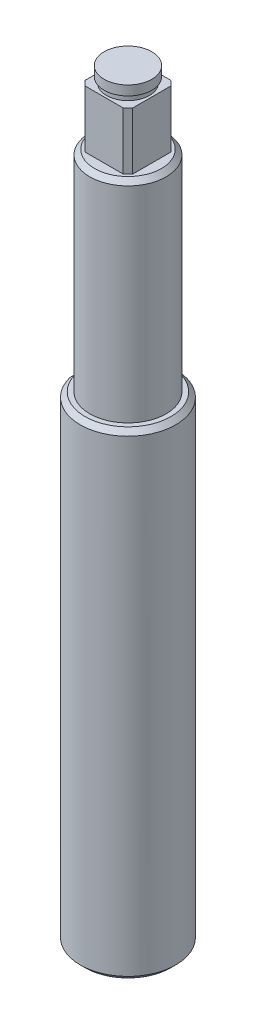
ISO-10303-21;
HEADER;
FILE_DESCRIPTION(('STEP AP214'),'2;1');
FILE_NAME('part.step','',(''),(''),'','','');
FILE_SCHEMA(('AUTOMOTIVE_DESIGN { 1 0 10303 214 1 1 1 1 }'));
ENDSEC;
DATA;
#1=APPLICATION_CONTEXT('core data for automotive mechanical design processes');
#2=APPLICATION_PROTOCOL_DEFINITION('international standard','automotive_design',2000,#1);
#3=PRODUCT_CONTEXT('',#1,'mechanical');
#4=PRODUCT('Part','Part','',(#3));
#5=PRODUCT_RELATED_PRODUCT_CATEGORY('part','',(#4));
#6=PRODUCT_DEFINITION_FORMATION('','',#4);
#7=PRODUCT_DEFINITION_CONTEXT('part definition',#1,'design');
#8=PRODUCT_DEFINITION('design','',#6,#7);
#9=PRODUCT_DEFINITION_SHAPE('','',#8);
#10=(LENGTH_UNIT() NAMED_UNIT(*) SI_UNIT(.MILLI.,.METRE.));
#11=(NAMED_UNIT(*) PLANE_ANGLE_UNIT() SI_UNIT($,.RADIAN.));
#12=(NAMED_UNIT(*) SI_UNIT($,.STERADIAN.) SOLID_ANGLE_UNIT());
#13=UNCERTAINTY_MEASURE_WITH_UNIT(LENGTH_MEASURE(1.E-05),#10,'distance_accuracy_value','');
#14=(GEOMETRIC_REPRESENTATION_CONTEXT(3) GLOBAL_UNCERTAINTY_ASSIGNED_CONTEXT((#13)) GLOBAL_UNIT_ASSIGNED_CONTEXT((#10,
#11,#12)) REPRESENTATION_CONTEXT('',''));
#15=CARTESIAN_POINT('',(0.,0.,0.));
#16=DIRECTION('',(0.,0.,1.));
#17=DIRECTION('',(1.,0.,0.));
#18=AXIS2_PLACEMENT_3D('',#15,#16,#17);
#19=CARTESIAN_POINT('',(0.,47.,0.));
#20=DIRECTION('',(0.,1.,0.));
#21=DIRECTION('',(0.,0.,1.));
#22=AXIS2_PLACEMENT_3D('',#19,#20,#21);
#23=PLANE('',#22);
#24=CARTESIAN_POINT('',(0.,47.,0.));
#25=DIRECTION('',(0.,1.,0.));
#26=DIRECTION('',(0.,0.,1.));
#27=AXIS2_PLACEMENT_3D('',#24,#25,#26);
#28=CIRCLE('',#27,3.5);
#29=CARTESIAN_POINT('',(0.,47.,3.5));
#30=VERTEX_POINT('',#29);
#31=EDGE_CURVE('E261',#30,#30,#28,.T.);
#32=ORIENTED_EDGE('',*,*,#31,.T.);
#33=EDGE_LOOP('',(#32));
#34=FACE_BOUND('',#33,.T.);
#35=DIRECTION('',(-1.,0.,0.));
#36=VECTOR('',#35,1.);
#37=CARTESIAN_POINT('',(-2.5,47.,-2.5));
#38=LINE('',#37,#36);
#39=CARTESIAN_POINT('',(2.00000000000001,47.,-2.5));
#40=VERTEX_POINT('',#39);
#41=CARTESIAN_POINT('',(-2.,47.,-2.5));
#42=VERTEX_POINT('',#41);
#43=EDGE_CURVE('E179',#40,#42,#38,.T.);
#44=ORIENTED_EDGE('',*,*,#43,.F.);
#45=DIRECTION('',(-0.707106781186542,0.,-0.707106781186553));
#46=VECTOR('',#45,1.);
#47=CARTESIAN_POINT('',(2.00000000000001,47.,-2.5));
#48=LINE('',#47,#46);
#49=CARTESIAN_POINT('',(2.5,47.,-2.));
#50=VERTEX_POINT('',#49);
#51=EDGE_CURVE('E175',#40,#50,#48,.F.);
#52=ORIENTED_EDGE('',*,*,#51,.T.);
#53=DIRECTION('',(0.,0.,-1.));
#54=VECTOR('',#53,1.);
#55=CARTESIAN_POINT('',(2.5,47.,2.5));
#56=LINE('',#55,#54);
#57=CARTESIAN_POINT('',(2.5,47.,2.00000000000001));
#58=VERTEX_POINT('',#57);
#59=EDGE_CURVE('E178',#58,#50,#56,.T.);
#60=ORIENTED_EDGE('',*,*,#59,.F.);
#61=DIRECTION('',(0.707106781186552,0.,-0.707106781186543));
#62=VECTOR('',#61,1.);
#63=CARTESIAN_POINT('',(2.5,47.,2.00000000000001));
#64=LINE('',#63,#62);
#65=CARTESIAN_POINT('',(2.,47.,2.5));
#66=VERTEX_POINT('',#65);
#67=EDGE_CURVE('E128',#58,#66,#64,.F.);
#68=ORIENTED_EDGE('',*,*,#67,.T.);
#69=DIRECTION('',(1.,0.,0.));
#70=VECTOR('',#69,1.);
#71=CARTESIAN_POINT('',(-2.5,47.,2.5));
#72=LINE('',#71,#70);
#73=CARTESIAN_POINT('',(-2.00000000000001,47.,2.5));
#74=VERTEX_POINT('',#73);
#75=EDGE_CURVE('E214',#74,#66,#72,.T.);
#76=ORIENTED_EDGE('',*,*,#75,.F.);
#77=DIRECTION('',(0.707106781186543,0.,0.707106781186552));
#78=VECTOR('',#77,1.);
#79=CARTESIAN_POINT('',(-2.00000000000001,47.,2.5));
#80=LINE('',#79,#78);
#81=CARTESIAN_POINT('',(-2.5,47.,2.));
#82=VERTEX_POINT('',#81);
#83=EDGE_CURVE('E62',#74,#82,#80,.F.);
#84=ORIENTED_EDGE('',*,*,#83,.T.);
#85=DIRECTION('',(0.,0.,1.));
#86=VECTOR('',#85,1.);
#87=CARTESIAN_POINT('',(-2.5,47.,2.5));
#88=LINE('',#87,#86);
#89=CARTESIAN_POINT('',(-2.5,47.,-2.00000000000001));
#90=VERTEX_POINT('',#89);
#91=EDGE_CURVE('E130',#90,#82,#88,.T.);
#92=ORIENTED_EDGE('',*,*,#91,.F.);
#93=DIRECTION('',(-0.707106781186552,0.,0.707106781186543));
#94=VECTOR('',#93,1.);
#95=CARTESIAN_POINT('',(-2.5,47.,-2.00000000000001));
#96=LINE('',#95,#94);
#97=EDGE_CURVE('E13',#90,#42,#96,.F.);
#98=ORIENTED_EDGE('',*,*,#97,.T.);
#99=EDGE_LOOP('',(#44,#52,#60,#68,#76,#84,#92,#98));
#100=FACE_BOUND('',#99,.T.);
#101=ADVANCED_FACE('F49',(#34,#100),#23,.T.);
#102=CARTESIAN_POINT('',(0.,25.,0.));
#103=DIRECTION('',(0.,-1.,0.));
#104=DIRECTION('',(0.,0.,-1.));
#105=AXIS2_PLACEMENT_3D('',#102,#103,#104);
#106=CYLINDRICAL_SURFACE('',#105,5.);
#107=CARTESIAN_POINT('',(0.,-24.5,0.));
#108=DIRECTION('',(0.,1.,0.));
#109=DIRECTION('',(0.,0.,1.));
#110=AXIS2_PLACEMENT_3D('',#107,#108,#109);
#111=CIRCLE('',#110,5.);
#112=CARTESIAN_POINT('',(0.,-24.5,5.));
#113=VERTEX_POINT('',#112);
#114=EDGE_CURVE('E352',#113,#113,#111,.T.);
#115=ORIENTED_EDGE('',*,*,#114,.T.);
#116=EDGE_LOOP('',(#115));
#117=FACE_BOUND('',#116,.T.);
#118=DIRECTION('',(0.,-1.,0.));
#119=VECTOR('',#118,1.);
#120=CARTESIAN_POINT('',(-4.84122918275927,25.,-1.25));
#121=LINE('',#120,#119);
#122=CARTESIAN_POINT('',(-4.84122918275927,12.,-1.25));
#123=VERTEX_POINT('',#122);
#124=CARTESIAN_POINT('',(-4.84122918275927,24.5,-1.25));
#125=VERTEX_POINT('',#124);
#126=EDGE_CURVE('E407',#123,#125,#121,.F.);
#127=ORIENTED_EDGE('',*,*,#126,.T.);
#128=CARTESIAN_POINT('',(0.,24.5,0.));
#129=DIRECTION('',(0.,1.,0.));
#130=DIRECTION('',(0.,0.,1.));
#131=AXIS2_PLACEMENT_3D('',#128,#129,#130);
#132=CIRCLE('',#131,5.);
#133=CARTESIAN_POINT('',(-4.84122918275927,24.5,1.25));
#134=VERTEX_POINT('',#133);
#135=EDGE_CURVE('E356',#125,#134,#132,.F.);
#136=ORIENTED_EDGE('',*,*,#135,.T.);
#137=DIRECTION('',(0.,-1.,0.));
#138=VECTOR('',#137,1.);
#139=CARTESIAN_POINT('',(-4.84122918275927,25.,1.25));
#140=LINE('',#139,#138);
#141=CARTESIAN_POINT('',(-4.84122918275927,12.,1.25));
#142=VERTEX_POINT('',#141);
#143=EDGE_CURVE('E421',#134,#142,#140,.T.);
#144=ORIENTED_EDGE('',*,*,#143,.T.);
#145=CARTESIAN_POINT('',(-4.84122918275927,12.,1.25));
#146=CARTESIAN_POINT('',(-4.84122685725221,11.9654212686168,1.25000042187014));
#147=CARTESIAN_POINT('',(-4.84160012436838,11.9308596712272,1.24856425921921));
#148=CARTESIAN_POINT('',(-4.84307380968198,11.8619949558705,1.2428391192447));
#149=CARTESIAN_POINT('',(-4.84417410552109,11.8276917953911,1.23855062196585));
#150=CARTESIAN_POINT('',(-4.84852138715067,11.7256835334889,1.22146904922816));
#151=CARTESIAN_POINT('',(-4.85281503936011,11.6586794143972,1.20445961896562));
#152=CARTESIAN_POINT('',(-4.86369278235003,11.5285941577725,1.15974759531));
#153=CARTESIAN_POINT('',(-4.87027665788662,11.4655126522339,1.1320460067798));
#154=CARTESIAN_POINT('',(-4.88498918089924,11.3448606891908,1.06676922253233));
#155=CARTESIAN_POINT('',(-4.89311824244559,11.2872917151363,1.02919137919617));
#156=CARTESIAN_POINT('',(-4.91020327997531,11.1780701476174,0.944355589785088));
#157=CARTESIAN_POINT('',(-4.91917238786145,11.1265563921931,0.896921585979972));
#158=CARTESIAN_POINT('',(-4.93681380495242,11.0321223881466,0.79409472564529));
#159=CARTESIAN_POINT('',(-4.94548606653171,10.9892035131651,0.738700599348542));
#160=CARTESIAN_POINT('',(-4.9617022785406,10.9126112479767,0.620571124252116));
#161=CARTESIAN_POINT('',(-4.96922880852163,10.87907513002,0.557744175418094));
#162=CARTESIAN_POINT('',(-4.98215432813236,10.8230940822541,0.427128238553651));
#163=CARTESIAN_POINT('',(-4.98755373643376,10.8006469696252,0.359340230103765));
#164=CARTESIAN_POINT('',(-4.9955237500641,10.7679262590282,0.222180135656453));
#165=CARTESIAN_POINT('',(-4.99814941126626,10.7574154094715,0.152867902503575));
#166=CARTESIAN_POINT('',(-5.00046797688519,10.7481207855709,0.0134159696021018));
#167=CARTESIAN_POINT('',(-5.00016124991806,10.7493355372596,-0.0567236250358797));
#168=CARTESIAN_POINT('',(-4.9966904670717,10.7632874546068,-0.194190616215118));
#169=CARTESIAN_POINT('',(-4.99358998346701,10.7757682707493,-0.261545877174816));
#170=CARTESIAN_POINT('',(-4.9849541329562,10.8114858489784,-0.393173388855423));
#171=CARTESIAN_POINT('',(-4.97941865831945,10.8347230869607,-0.457445503029982));
#172=CARTESIAN_POINT('',(-4.96643747202248,10.8915016008383,-0.581759107530671));
#173=CARTESIAN_POINT('',(-4.95897492284444,10.925134242791,-0.641757037002808));
#174=CARTESIAN_POINT('',(-4.94294931927399,11.0016789122918,-0.755345789037515));
#175=CARTESIAN_POINT('',(-4.93438609916498,11.0445923378165,-0.808935644452858));
#176=CARTESIAN_POINT('',(-4.91681957528582,11.1398486401016,-0.90971173713561));
#177=CARTESIAN_POINT('',(-4.90781063097107,11.1924145456748,-0.956686378817657));
#178=CARTESIAN_POINT('',(-4.89057710355008,11.3047873336597,-1.04121196898279));
#179=CARTESIAN_POINT('',(-4.88235273553742,11.3645961916045,-1.07876033780632));
#180=CARTESIAN_POINT('',(-4.86759766982907,11.4901819972797,-1.14350588660745));
#181=CARTESIAN_POINT('',(-4.86107632511421,11.5559893311201,-1.17064627235908));
#182=CARTESIAN_POINT('',(-4.85058823508819,11.6913961605229,-1.21337793981228));
#183=CARTESIAN_POINT('',(-4.84661767201794,11.7609898189373,-1.22898648651516));
#184=CARTESIAN_POINT('',(-4.84319113351905,11.8593217259486,-1.24238079393867));
#185=CARTESIAN_POINT('',(-4.84245653888575,11.8873996290165,-1.24523848870838));
#186=CARTESIAN_POINT('',(-4.84147578111218,11.9436472373866,-1.24904594712174));
#187=CARTESIAN_POINT('',(-4.84122882774326,11.9718167199441,-1.24999879762005));
#188=CARTESIAN_POINT('',(-4.84122918275927,12.,-1.25));
#189=B_SPLINE_CURVE_WITH_KNOTS('',3,(#145,#146,#147,#148,#149,#150,#151,#152,#153,#154,#155,
#156,#157,#158,#159,#160,#161,#162,#163,#164,#165,#166,#167,#168,#169,#170,#171,#172,#173,#174,
#175,#176,#177,#178,#179,#180,#181,#182,#183,#184,#185,#186,#187,#188),.UNSPECIFIED.,.F.,.F.,(4,
2,2,2,2,2,2,2,2,2,2,2,2,2,2,2,2,2,2,2,2,4),(0.,0.103670662924712,0.207323882605814,
0.414037453850396,0.620731602614377,0.827481218408437,1.03830237178497,1.24915719192399,
1.46295233872793,1.67670538415531,1.88613101894156,2.09553032820799,2.30028181849094,
2.50504236844798,2.7116563681297,2.91830151205411,3.13051786918178,3.34279223976209,
3.55620900201334,3.76930559424982,3.8539481090331,3.93845334664589),.UNSPECIFIED.);
#190=EDGE_CURVE('E253',#142,#123,#189,.T.);
#191=ORIENTED_EDGE('',*,*,#190,.T.);
#192=EDGE_LOOP('',(#127,#136,#144,#191));
#193=FACE_BOUND('',#192,.T.);
#194=ADVANCED_FACE('F263',(#117,#193),#106,.T.);
#195=CARTESIAN_POINT('',(0.,25.,0.));
#196=DIRECTION('',(0.,1.,0.));
#197=DIRECTION('',(0.,0.,1.));
#198=AXIS2_PLACEMENT_3D('',#195,#196,#197);
#199=PLANE('',#198);
#200=DIRECTION('',(1.,0.,0.));
#201=VECTOR('',#200,1.);
#202=CARTESIAN_POINT('',(0.,25.,1.25));
#203=LINE('',#202,#201);
#204=CARTESIAN_POINT('',(-4.32290411644766,25.,1.25));
#205=VERTEX_POINT('',#204);
#206=CARTESIAN_POINT('',(-4.1,25.,1.25));
#207=VERTEX_POINT('',#206);
#208=EDGE_CURVE('E250',#205,#207,#203,.T.);
#209=ORIENTED_EDGE('',*,*,#208,.F.);
#210=CARTESIAN_POINT('',(0.,25.,0.));
#211=DIRECTION('',(0.,1.,0.));
#212=DIRECTION('',(0.,0.,1.));
#213=AXIS2_PLACEMENT_3D('',#210,#211,#212);
#214=CIRCLE('',#213,4.50000000000002);
#215=CARTESIAN_POINT('',(-4.32290411644766,25.,-1.25));
#216=VERTEX_POINT('',#215);
#217=EDGE_CURVE('E292',#205,#216,#214,.T.);
#218=ORIENTED_EDGE('',*,*,#217,.T.);
#219=DIRECTION('',(-1.,0.,0.));
#220=VECTOR('',#219,1.);
#221=CARTESIAN_POINT('',(0.,25.,-1.25));
#222=LINE('',#221,#220);
#223=CARTESIAN_POINT('',(-4.1,25.,-1.25));
#224=VERTEX_POINT('',#223);
#225=EDGE_CURVE('E243',#224,#216,#222,.T.);
#226=ORIENTED_EDGE('',*,*,#225,.F.);
#227=DIRECTION('',(0.,0.,1.));
#228=VECTOR('',#227,1.);
#229=CARTESIAN_POINT('',(-4.1,25.,0.));
#230=LINE('',#229,#228);
#231=EDGE_CURVE('E232',#224,#207,#230,.T.);
#232=ORIENTED_EDGE('',*,*,#231,.T.);
#233=EDGE_LOOP('',(#209,#218,#226,#232));
#234=FACE_BOUND('',#233,.T.);
#235=CARTESIAN_POINT('',(0.,25.,0.));
#236=DIRECTION('',(0.,1.,0.));
#237=DIRECTION('',(0.,0.,1.));
#238=AXIS2_PLACEMENT_3D('',#235,#236,#237);
#239=CIRCLE('',#238,4.);
#240=CARTESIAN_POINT('',(0.,25.,4.));
#241=VERTEX_POINT('',#240);
#242=EDGE_CURVE('E218',#241,#241,#239,.T.);
#243=ORIENTED_EDGE('',*,*,#242,.F.);
#244=EDGE_LOOP('',(#243));
#245=FACE_BOUND('',#244,.T.);
#246=ADVANCED_FACE('F328',(#234,#245),#199,.T.);
#247=CARTESIAN_POINT('',(0.,-25.,0.));
#248=DIRECTION('',(0.,1.,0.));
#249=DIRECTION('',(0.,0.,1.));
#250=AXIS2_PLACEMENT_3D('',#247,#248,#249);
#251=PLANE('',#250);
#252=CARTESIAN_POINT('',(0.,-25.,0.));
#253=DIRECTION('',(0.,1.,0.));
#254=DIRECTION('',(0.,0.,1.));
#255=AXIS2_PLACEMENT_3D('',#252,#253,#254);
#256=CIRCLE('',#255,4.5);
#257=CARTESIAN_POINT('',(0.,-25.,4.5));
#258=VERTEX_POINT('',#257);
#259=EDGE_CURVE('E346',#258,#258,#256,.F.);
#260=ORIENTED_EDGE('',*,*,#259,.T.);
#261=EDGE_LOOP('',(#260));
#262=FACE_BOUND('',#261,.T.);
#263=ADVANCED_FACE('F338',(#262),#251,.F.);
#264=CARTESIAN_POINT('',(0.,47.,0.));
#265=DIRECTION('',(0.,-1.,0.));
#266=DIRECTION('',(0.,0.,-1.));
#267=AXIS2_PLACEMENT_3D('',#264,#265,#266);
#268=CYLINDRICAL_SURFACE('',#267,4.);
#269=CARTESIAN_POINT('',(0.,46.5,0.));
#270=DIRECTION('',(0.,1.,0.));
#271=DIRECTION('',(0.,0.,1.));
#272=AXIS2_PLACEMENT_3D('',#269,#270,#271);
#273=CIRCLE('',#272,4.);
#274=CARTESIAN_POINT('',(0.,46.5,4.));
#275=VERTEX_POINT('',#274);
#276=EDGE_CURVE('E363',#275,#275,#273,.F.);
#277=ORIENTED_EDGE('',*,*,#276,.T.);
#278=EDGE_LOOP('',(#277));
#279=FACE_BOUND('',#278,.T.);
#280=ORIENTED_EDGE('',*,*,#242,.T.);
#281=EDGE_LOOP('',(#280));
#282=FACE_BOUND('',#281,.T.);
#283=ADVANCED_FACE('F333',(#279,#282),#268,.T.);
#284=CARTESIAN_POINT('',(2.5,53.,2.5));
#285=DIRECTION('',(-1.,0.,0.));
#286=DIRECTION('',(0.,0.,1.));
#287=AXIS2_PLACEMENT_3D('',#284,#285,#286);
#288=PLANE('',#287);
#289=DIRECTION('',(0.,0.,-1.));
#290=VECTOR('',#289,1.);
#291=CARTESIAN_POINT('',(2.5,53.,2.5));
#292=LINE('',#291,#290);
#293=CARTESIAN_POINT('',(2.5,53.,2.00000000000001));
#294=VERTEX_POINT('',#293);
#295=CARTESIAN_POINT('',(2.5,53.,-2.));
#296=VERTEX_POINT('',#295);
#297=EDGE_CURVE('E224',#294,#296,#292,.T.);
#298=ORIENTED_EDGE('',*,*,#297,.F.);
#299=DIRECTION('',(0.,-1.,0.));
#300=VECTOR('',#299,1.);
#301=CARTESIAN_POINT('',(2.5,53.,2.00000000000001));
#302=LINE('',#301,#300);
#303=EDGE_CURVE('E187',#294,#58,#302,.T.);
#304=ORIENTED_EDGE('',*,*,#303,.T.);
#305=ORIENTED_EDGE('',*,*,#59,.T.);
#306=DIRECTION('',(0.,1.,0.));
#307=VECTOR('',#306,1.);
#308=CARTESIAN_POINT('',(2.5,53.,-2.));
#309=LINE('',#308,#307);
#310=EDGE_CURVE('E97',#50,#296,#309,.T.);
#311=ORIENTED_EDGE('',*,*,#310,.T.);
#312=EDGE_LOOP('',(#298,#304,#305,#311));
#313=FACE_BOUND('',#312,.T.);
#314=ADVANCED_FACE('F184',(#313),#288,.F.);
#315=CARTESIAN_POINT('',(-2.5,53.,-2.5));
#316=DIRECTION('',(0.,0.,1.));
#317=DIRECTION('',(1.,0.,0.));
#318=AXIS2_PLACEMENT_3D('',#315,#316,#317);
#319=PLANE('',#318);
#320=DIRECTION('',(-1.,0.,0.));
#321=VECTOR('',#320,1.);
#322=CARTESIAN_POINT('',(-2.5,53.,-2.5));
#323=LINE('',#322,#321);
#324=CARTESIAN_POINT('',(2.00000000000001,53.,-2.5));
#325=VERTEX_POINT('',#324);
#326=CARTESIAN_POINT('',(-2.,53.,-2.5));
#327=VERTEX_POINT('',#326);
#328=EDGE_CURVE('E145',#325,#327,#323,.T.);
#329=ORIENTED_EDGE('',*,*,#328,.F.);
#330=DIRECTION('',(0.,-1.,0.));
#331=VECTOR('',#330,1.);
#332=CARTESIAN_POINT('',(2.00000000000001,53.,-2.5));
#333=LINE('',#332,#331);
#334=EDGE_CURVE('E163',#325,#40,#333,.T.);
#335=ORIENTED_EDGE('',*,*,#334,.T.);
#336=ORIENTED_EDGE('',*,*,#43,.T.);
#337=DIRECTION('',(0.,1.,0.));
#338=VECTOR('',#337,1.);
#339=CARTESIAN_POINT('',(-2.,53.,-2.5));
#340=LINE('',#339,#338);
#341=EDGE_CURVE('E161',#42,#327,#340,.T.);
#342=ORIENTED_EDGE('',*,*,#341,.T.);
#343=EDGE_LOOP('',(#329,#335,#336,#342));
#344=FACE_BOUND('',#343,.T.);
#345=ADVANCED_FACE('F445',(#344),#319,.F.);
#346=CARTESIAN_POINT('',(-2.5,53.,2.5));
#347=DIRECTION('',(1.,0.,0.));
#348=DIRECTION('',(0.,0.,-1.));
#349=AXIS2_PLACEMENT_3D('',#346,#347,#348);
#350=PLANE('',#349);
#351=ORIENTED_EDGE('',*,*,#91,.T.);
#352=DIRECTION('',(0.,1.,0.));
#353=VECTOR('',#352,1.);
#354=CARTESIAN_POINT('',(-2.5,53.,2.));
#355=LINE('',#354,#353);
#356=CARTESIAN_POINT('',(-2.5,53.,2.));
#357=VERTEX_POINT('',#356);
#358=EDGE_CURVE('E121',#82,#357,#355,.T.);
#359=ORIENTED_EDGE('',*,*,#358,.T.);
#360=DIRECTION('',(0.,0.,1.));
#361=VECTOR('',#360,1.);
#362=CARTESIAN_POINT('',(-2.5,53.,2.5));
#363=LINE('',#362,#361);
#364=CARTESIAN_POINT('',(-2.5,53.,-2.00000000000001));
#365=VERTEX_POINT('',#364);
#366=EDGE_CURVE('E124',#365,#357,#363,.T.);
#367=ORIENTED_EDGE('',*,*,#366,.F.);
#368=DIRECTION('',(0.,-1.,0.));
#369=VECTOR('',#368,1.);
#370=CARTESIAN_POINT('',(-2.5,53.,-2.00000000000001));
#371=LINE('',#370,#369);
#372=EDGE_CURVE('E132',#365,#90,#371,.T.);
#373=ORIENTED_EDGE('',*,*,#372,.T.);
#374=EDGE_LOOP('',(#351,#359,#367,#373));
#375=FACE_BOUND('',#374,.T.);
#376=ADVANCED_FACE('F123',(#375),#350,.F.);
#377=CARTESIAN_POINT('',(-2.5,53.,2.5));
#378=DIRECTION('',(0.,0.,-1.));
#379=DIRECTION('',(-1.,0.,0.));
#380=AXIS2_PLACEMENT_3D('',#377,#378,#379);
#381=PLANE('',#380);
#382=ORIENTED_EDGE('',*,*,#75,.T.);
#383=DIRECTION('',(0.,1.,0.));
#384=VECTOR('',#383,1.);
#385=CARTESIAN_POINT('',(2.,53.,2.5));
#386=LINE('',#385,#384);
#387=CARTESIAN_POINT('',(2.,53.,2.5));
#388=VERTEX_POINT('',#387);
#389=EDGE_CURVE('E154',#66,#388,#386,.T.);
#390=ORIENTED_EDGE('',*,*,#389,.T.);
#391=DIRECTION('',(1.,0.,0.));
#392=VECTOR('',#391,1.);
#393=CARTESIAN_POINT('',(-2.5,53.,2.5));
#394=LINE('',#393,#392);
#395=CARTESIAN_POINT('',(-2.00000000000001,53.,2.5));
#396=VERTEX_POINT('',#395);
#397=EDGE_CURVE('E141',#396,#388,#394,.T.);
#398=ORIENTED_EDGE('',*,*,#397,.F.);
#399=DIRECTION('',(0.,-1.,0.));
#400=VECTOR('',#399,1.);
#401=CARTESIAN_POINT('',(-2.00000000000001,53.,2.5));
#402=LINE('',#401,#400);
#403=EDGE_CURVE('E150',#396,#74,#402,.T.);
#404=ORIENTED_EDGE('',*,*,#403,.T.);
#405=EDGE_LOOP('',(#382,#390,#398,#404));
#406=FACE_BOUND('',#405,.T.);
#407=ADVANCED_FACE('F212',(#406),#381,.F.);
#408=CARTESIAN_POINT('',(0.,53.,0.));
#409=DIRECTION('',(0.,-1.,0.));
#410=DIRECTION('',(0.,0.,-1.));
#411=AXIS2_PLACEMENT_3D('',#408,#409,#410);
#412=PLANE('',#411);
#413=ORIENTED_EDGE('',*,*,#397,.T.);
#414=DIRECTION('',(-0.707106781186552,0.,0.707106781186543));
#415=VECTOR('',#414,1.);
#416=CARTESIAN_POINT('',(2.5,53.,2.00000000000001));
#417=LINE('',#416,#415);
#418=EDGE_CURVE('E153',#388,#294,#417,.F.);
#419=ORIENTED_EDGE('',*,*,#418,.T.);
#420=ORIENTED_EDGE('',*,*,#297,.T.);
#421=DIRECTION('',(0.707106781186542,0.,0.707106781186553));
#422=VECTOR('',#421,1.);
#423=CARTESIAN_POINT('',(2.00000000000001,53.,-2.5));
#424=LINE('',#423,#422);
#425=EDGE_CURVE('E149',#296,#325,#424,.F.);
#426=ORIENTED_EDGE('',*,*,#425,.T.);
#427=ORIENTED_EDGE('',*,*,#328,.T.);
#428=DIRECTION('',(0.707106781186552,0.,-0.707106781186543));
#429=VECTOR('',#428,1.);
#430=CARTESIAN_POINT('',(-2.5,53.,-2.00000000000001));
#431=LINE('',#430,#429);
#432=EDGE_CURVE('E143',#327,#365,#431,.F.);
#433=ORIENTED_EDGE('',*,*,#432,.T.);
#434=ORIENTED_EDGE('',*,*,#366,.T.);
#435=DIRECTION('',(-0.707106781186543,0.,-0.707106781186552));
#436=VECTOR('',#435,1.);
#437=CARTESIAN_POINT('',(-2.00000000000001,53.,2.5));
#438=LINE('',#437,#436);
#439=EDGE_CURVE('E140',#357,#396,#438,.F.);
#440=ORIENTED_EDGE('',*,*,#439,.T.);
#441=EDGE_LOOP('',(#413,#419,#420,#426,#427,#433,#434,#440));
#442=FACE_BOUND('',#441,.T.);
#443=CARTESIAN_POINT('',(0.,53.,0.));
#444=DIRECTION('',(0.,1.,0.));
#445=DIRECTION('',(0.,0.,1.));
#446=AXIS2_PLACEMENT_3D('',#443,#444,#445);
#447=CIRCLE('',#446,2.25);
#448=CARTESIAN_POINT('',(0.,53.,2.25));
#449=VERTEX_POINT('',#448);
#450=EDGE_CURVE('E430',#449,#449,#447,.T.);
#451=ORIENTED_EDGE('',*,*,#450,.F.);
#452=EDGE_LOOP('',(#451));
#453=FACE_BOUND('',#452,.T.);
#454=ADVANCED_FACE('F131',(#442,#453),#412,.F.);
#455=CARTESIAN_POINT('',(0.,53.6,0.));
#456=DIRECTION('',(0.,1.,0.));
#457=DIRECTION('',(0.,0.,1.));
#458=AXIS2_PLACEMENT_3D('',#455,#456,#457);
#459=PLANE('',#458);
#460=CARTESIAN_POINT('',(0.,53.6,0.));
#461=DIRECTION('',(0.,1.,0.));
#462=DIRECTION('',(0.,0.,1.));
#463=AXIS2_PLACEMENT_3D('',#460,#461,#462);
#464=CIRCLE('',#463,2.25);
#465=CARTESIAN_POINT('',(0.,53.6,2.25));
#466=VERTEX_POINT('',#465);
#467=EDGE_CURVE('E239',#466,#466,#464,.T.);
#468=ORIENTED_EDGE('',*,*,#467,.T.);
#469=EDGE_LOOP('',(#468));
#470=FACE_BOUND('',#469,.T.);
#471=CARTESIAN_POINT('',(0.,53.6,0.));
#472=DIRECTION('',(0.,1.,0.));
#473=DIRECTION('',(0.,0.,1.));
#474=AXIS2_PLACEMENT_3D('',#471,#472,#473);
#475=CIRCLE('',#474,2.5);
#476=CARTESIAN_POINT('',(0.,53.6,2.5));
#477=VERTEX_POINT('',#476);
#478=EDGE_CURVE('E234',#477,#477,#475,.T.);
#479=ORIENTED_EDGE('',*,*,#478,.F.);
#480=EDGE_LOOP('',(#479));
#481=FACE_BOUND('',#480,.T.);
#482=ADVANCED_FACE('F455',(#470,#481),#459,.F.);
#483=CARTESIAN_POINT('',(0.,53.6,0.));
#484=DIRECTION('',(0.,-1.,0.));
#485=DIRECTION('',(0.,0.,-1.));
#486=AXIS2_PLACEMENT_3D('',#483,#484,#485);
#487=CYLINDRICAL_SURFACE('',#486,2.25);
#488=ORIENTED_EDGE('',*,*,#467,.F.);
#489=EDGE_LOOP('',(#488));
#490=FACE_BOUND('',#489,.T.);
#491=ORIENTED_EDGE('',*,*,#450,.T.);
#492=EDGE_LOOP('',(#491));
#493=FACE_BOUND('',#492,.T.);
#494=ADVANCED_FACE('F285',(#490,#493),#487,.T.);
#495=CARTESIAN_POINT('',(0.,54.6,0.));
#496=DIRECTION('',(0.,1.,0.));
#497=DIRECTION('',(0.,0.,1.));
#498=AXIS2_PLACEMENT_3D('',#495,#496,#497);
#499=PLANE('',#498);
#500=CARTESIAN_POINT('',(0.,54.6,0.));
#501=DIRECTION('',(0.,1.,0.));
#502=DIRECTION('',(0.,0.,1.));
#503=AXIS2_PLACEMENT_3D('',#500,#501,#502);
#504=CIRCLE('',#503,2.5);
#505=CARTESIAN_POINT('',(0.,54.6,2.5));
#506=VERTEX_POINT('',#505);
#507=EDGE_CURVE('E188',#506,#506,#504,.T.);
#508=ORIENTED_EDGE('',*,*,#507,.T.);
#509=EDGE_LOOP('',(#508));
#510=FACE_BOUND('',#509,.T.);
#511=ADVANCED_FACE('F453',(#510),#499,.T.);
#512=CARTESIAN_POINT('',(0.,141.271067811865,0.));
#513=DIRECTION('',(0.,-1.,0.));
#514=DIRECTION('',(0.,0.,-1.));
#515=AXIS2_PLACEMENT_3D('',#512,#513,#514);
#516=CYLINDRICAL_SURFACE('',#515,2.5);
#517=ORIENTED_EDGE('',*,*,#478,.T.);
#518=EDGE_LOOP('',(#517));
#519=FACE_BOUND('',#518,.T.);
#520=ORIENTED_EDGE('',*,*,#507,.F.);
#521=EDGE_LOOP('',(#520));
#522=FACE_BOUND('',#521,.T.);
#523=ADVANCED_FACE('F275',(#519,#522),#516,.T.);
#524=CARTESIAN_POINT('',(-4.1,12.,0.));
#525=DIRECTION('',(-1.,0.,0.));
#526=DIRECTION('',(0.,0.,1.));
#527=AXIS2_PLACEMENT_3D('',#524,#525,#526);
#528=CYLINDRICAL_SURFACE('',#527,1.25);
#529=DIRECTION('',(-1.,0.,0.));
#530=VECTOR('',#529,1.);
#531=CARTESIAN_POINT('',(-4.1,12.,1.25));
#532=LINE('',#531,#530);
#533=CARTESIAN_POINT('',(-4.1,12.,1.25));
#534=VERTEX_POINT('',#533);
#535=EDGE_CURVE('E409',#534,#142,#532,.T.);
#536=ORIENTED_EDGE('',*,*,#535,.F.);
#537=CARTESIAN_POINT('',(-4.1,12.,0.));
#538=DIRECTION('',(-1.,0.,0.));
#539=DIRECTION('',(0.,0.,1.));
#540=AXIS2_PLACEMENT_3D('',#537,#538,#539);
#541=CIRCLE('',#540,1.25);
#542=CARTESIAN_POINT('',(-4.1,12.,-1.25));
#543=VERTEX_POINT('',#542);
#544=EDGE_CURVE('E394',#543,#534,#541,.T.);
#545=ORIENTED_EDGE('',*,*,#544,.F.);
#546=DIRECTION('',(-1.,0.,0.));
#547=VECTOR('',#546,1.);
#548=CARTESIAN_POINT('',(-4.1,12.,-1.25));
#549=LINE('',#548,#547);
#550=EDGE_CURVE('E401',#543,#123,#549,.T.);
#551=ORIENTED_EDGE('',*,*,#550,.T.);
#552=ORIENTED_EDGE('',*,*,#190,.F.);
#553=EDGE_LOOP('',(#536,#545,#551,#552));
#554=FACE_BOUND('',#553,.T.);
#555=ADVANCED_FACE('F270',(#554),#528,.F.);
#556=CARTESIAN_POINT('',(-4.1,38.,1.25));
#557=DIRECTION('',(0.,0.,1.));
#558=DIRECTION('',(0.,-1.,0.));
#559=AXIS2_PLACEMENT_3D('',#556,#557,#558);
#560=PLANE('',#559);
#561=ORIENTED_EDGE('',*,*,#143,.F.);
#562=CARTESIAN_POINT('',(-4.84122918275927,24.5,1.25));
#563=CARTESIAN_POINT('',(-4.75500526228086,24.5835029107561,1.25));
#564=CARTESIAN_POINT('',(-4.66869954871015,24.6669210306922,1.25));
#565=CARTESIAN_POINT('',(-4.49592452662287,24.8335876973761,1.25));
#566=CARTESIAN_POINT('',(-4.40945521808971,24.9168362441066,1.25));
#567=CARTESIAN_POINT('',(-4.32290411644766,25.,1.25));
#568=B_SPLINE_CURVE_WITH_KNOTS('',3,(#562,#563,#564,#565,#566,#567),.UNSPECIFIED.,.F.,.F.,(4,2,
4),(0.,0.360090725175813,0.720181486871449),.UNSPECIFIED.);
#569=EDGE_CURVE('E193',#134,#205,#568,.T.);
#570=ORIENTED_EDGE('',*,*,#569,.T.);
#571=ORIENTED_EDGE('',*,*,#208,.T.);
#572=DIRECTION('',(0.,1.,0.));
#573=VECTOR('',#572,1.);
#574=CARTESIAN_POINT('',(-4.1,38.,1.25));
#575=LINE('',#574,#573);
#576=EDGE_CURVE('E406',#534,#207,#575,.T.);
#577=ORIENTED_EDGE('',*,*,#576,.F.);
#578=ORIENTED_EDGE('',*,*,#535,.T.);
#579=EDGE_LOOP('',(#561,#570,#571,#577,#578));
#580=FACE_BOUND('',#579,.T.);
#581=ADVANCED_FACE('F271',(#580),#560,.F.);
#582=CARTESIAN_POINT('',(-4.1,38.,-1.25));
#583=DIRECTION('',(0.,0.,-1.));
#584=DIRECTION('',(0.,1.,0.));
#585=AXIS2_PLACEMENT_3D('',#582,#583,#584);
#586=PLANE('',#585);
#587=ORIENTED_EDGE('',*,*,#225,.T.);
#588=CARTESIAN_POINT('',(-4.32290411644766,25.,-1.25));
#589=CARTESIAN_POINT('',(-4.40945521808971,24.9168362441066,-1.25));
#590=CARTESIAN_POINT('',(-4.49592452662287,24.8335876973761,-1.25));
#591=CARTESIAN_POINT('',(-4.66869954871015,24.6669210306922,-1.25));
#592=CARTESIAN_POINT('',(-4.75500526228086,24.5835029107561,-1.25));
#593=CARTESIAN_POINT('',(-4.84122918275927,24.5,-1.25));
#594=B_SPLINE_CURVE_WITH_KNOTS('',3,(#588,#589,#590,#591,#592,#593),.UNSPECIFIED.,.F.,.F.,(4,2,
4),(0.,0.360090761695636,0.720181486871449),.UNSPECIFIED.);
#595=EDGE_CURVE('E200',#216,#125,#594,.T.);
#596=ORIENTED_EDGE('',*,*,#595,.T.);
#597=ORIENTED_EDGE('',*,*,#126,.F.);
#598=ORIENTED_EDGE('',*,*,#550,.F.);
#599=DIRECTION('',(0.,-1.,0.));
#600=VECTOR('',#599,1.);
#601=CARTESIAN_POINT('',(-4.1,38.,-1.25));
#602=LINE('',#601,#600);
#603=EDGE_CURVE('E386',#224,#543,#602,.T.);
#604=ORIENTED_EDGE('',*,*,#603,.F.);
#605=EDGE_LOOP('',(#587,#596,#597,#598,#604));
#606=FACE_BOUND('',#605,.T.);
#607=ADVANCED_FACE('F277',(#606),#586,.F.);
#608=CARTESIAN_POINT('',(-4.1,38.,0.));
#609=DIRECTION('',(-1.,0.,0.));
#610=DIRECTION('',(0.,0.,1.));
#611=AXIS2_PLACEMENT_3D('',#608,#609,#610);
#612=PLANE('',#611);
#613=ORIENTED_EDGE('',*,*,#603,.T.);
#614=ORIENTED_EDGE('',*,*,#544,.T.);
#615=ORIENTED_EDGE('',*,*,#576,.T.);
#616=ORIENTED_EDGE('',*,*,#231,.F.);
#617=EDGE_LOOP('',(#613,#614,#615,#616));
#618=FACE_BOUND('',#617,.T.);
#619=ADVANCED_FACE('F278',(#618),#612,.T.);
#620=CARTESIAN_POINT('',(0.,47.,0.));
#621=DIRECTION('',(0.,-1.,0.));
#622=DIRECTION('',(0.,0.,-1.));
#623=AXIS2_PLACEMENT_3D('',#620,#621,#622);
#624=CONICAL_SURFACE('',#623,3.5,0.785398163397445);
#625=ORIENTED_EDGE('',*,*,#276,.F.);
#626=EDGE_LOOP('',(#625));
#627=FACE_BOUND('',#626,.T.);
#628=ORIENTED_EDGE('',*,*,#31,.F.);
#629=EDGE_LOOP('',(#628));
#630=FACE_BOUND('',#629,.T.);
#631=ADVANCED_FACE('F366',(#627,#630),#624,.T.);
#632=CARTESIAN_POINT('',(0.,-24.5,0.));
#633=DIRECTION('',(0.,1.,0.));
#634=DIRECTION('',(0.,0.,1.));
#635=AXIS2_PLACEMENT_3D('',#632,#633,#634);
#636=CONICAL_SURFACE('',#635,5.,0.785398163397443);
#637=ORIENTED_EDGE('',*,*,#259,.F.);
#638=EDGE_LOOP('',(#637));
#639=FACE_BOUND('',#638,.T.);
#640=ORIENTED_EDGE('',*,*,#114,.F.);
#641=EDGE_LOOP('',(#640));
#642=FACE_BOUND('',#641,.T.);
#643=ADVANCED_FACE('F303',(#639,#642),#636,.T.);
#644=CARTESIAN_POINT('',(0.,25.,0.));
#645=DIRECTION('',(0.,-1.,0.));
#646=DIRECTION('',(0.,0.,-1.));
#647=AXIS2_PLACEMENT_3D('',#644,#645,#646);
#648=CONICAL_SURFACE('',#647,4.50000000000002,0.785398163397443);
#649=ORIENTED_EDGE('',*,*,#569,.F.);
#650=ORIENTED_EDGE('',*,*,#135,.F.);
#651=ORIENTED_EDGE('',*,*,#595,.F.);
#652=ORIENTED_EDGE('',*,*,#217,.F.);
#653=EDGE_LOOP('',(#649,#650,#651,#652));
#654=FACE_BOUND('',#653,.T.);
#655=ADVANCED_FACE('F294',(#654),#648,.T.);
#656=CARTESIAN_POINT('',(2.5,53.,2.00000000000001));
#657=DIRECTION('',(-0.707106781186543,0.,-0.707106781186552));
#658=DIRECTION('',(0.,-1.,0.));
#659=AXIS2_PLACEMENT_3D('',#656,#657,#658);
#660=PLANE('',#659);
#661=ORIENTED_EDGE('',*,*,#418,.F.);
#662=ORIENTED_EDGE('',*,*,#389,.F.);
#663=ORIENTED_EDGE('',*,*,#67,.F.);
#664=ORIENTED_EDGE('',*,*,#303,.F.);
#665=EDGE_LOOP('',(#661,#662,#663,#664));
#666=FACE_BOUND('',#665,.T.);
#667=ADVANCED_FACE('F222',(#666),#660,.F.);
#668=CARTESIAN_POINT('',(2.00000000000001,53.,-2.5));
#669=DIRECTION('',(-0.707106781186553,0.,0.707106781186542));
#670=DIRECTION('',(0.,-1.,0.));
#671=AXIS2_PLACEMENT_3D('',#668,#669,#670);
#672=PLANE('',#671);
#673=ORIENTED_EDGE('',*,*,#425,.F.);
#674=ORIENTED_EDGE('',*,*,#310,.F.);
#675=ORIENTED_EDGE('',*,*,#51,.F.);
#676=ORIENTED_EDGE('',*,*,#334,.F.);
#677=EDGE_LOOP('',(#673,#674,#675,#676));
#678=FACE_BOUND('',#677,.T.);
#679=ADVANCED_FACE('F191',(#678),#672,.F.);
#680=CARTESIAN_POINT('',(-2.00000000000001,53.,2.5));
#681=DIRECTION('',(0.707106781186552,0.,-0.707106781186543));
#682=DIRECTION('',(0.,-1.,0.));
#683=AXIS2_PLACEMENT_3D('',#680,#681,#682);
#684=PLANE('',#683);
#685=ORIENTED_EDGE('',*,*,#439,.F.);
#686=ORIENTED_EDGE('',*,*,#358,.F.);
#687=ORIENTED_EDGE('',*,*,#83,.F.);
#688=ORIENTED_EDGE('',*,*,#403,.F.);
#689=EDGE_LOOP('',(#685,#686,#687,#688));
#690=FACE_BOUND('',#689,.T.);
#691=ADVANCED_FACE('F148',(#690),#684,.F.);
#692=CARTESIAN_POINT('',(-2.5,53.,-2.00000000000001));
#693=DIRECTION('',(0.707106781186543,0.,0.707106781186552));
#694=DIRECTION('',(0.,-1.,0.));
#695=AXIS2_PLACEMENT_3D('',#692,#693,#694);
#696=PLANE('',#695);
#697=ORIENTED_EDGE('',*,*,#432,.F.);
#698=ORIENTED_EDGE('',*,*,#341,.F.);
#699=ORIENTED_EDGE('',*,*,#97,.F.);
#700=ORIENTED_EDGE('',*,*,#372,.F.);
#701=EDGE_LOOP('',(#697,#698,#699,#700));
#702=FACE_BOUND('',#701,.T.);
#703=ADVANCED_FACE('F52',(#702),#696,.F.);
#704=CLOSED_SHELL('',(#101,#194,#246,#263,#283,#314,#345,#376,#407,#454,#482,#494,#511,#523,
#555,#581,#607,#619,#631,#643,#655,#667,#679,#691,#703));
#705=MANIFOLD_SOLID_BREP('B2',#704);
#706=ADVANCED_BREP_SHAPE_REPRESENTATION('',(#18,#705),#14);
#707=SHAPE_DEFINITION_REPRESENTATION(#9,#706);
ENDSEC;
END-ISO-10303-21;
